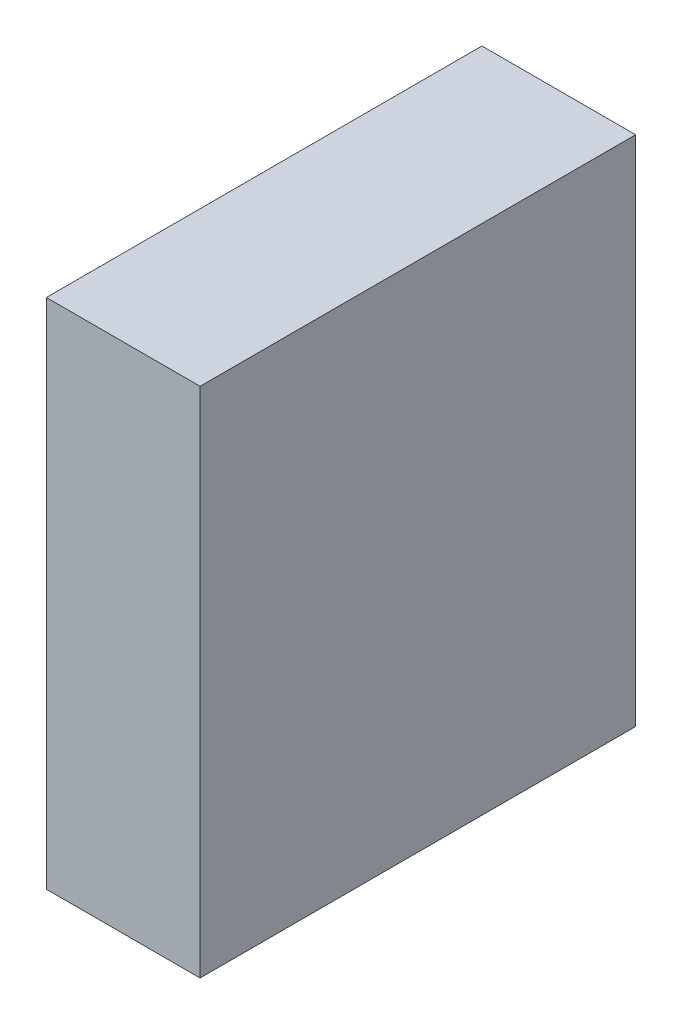
ISO-10303-21;
HEADER;
FILE_DESCRIPTION(('STEP AP214'),'2;1');
FILE_NAME('part.step','',(''),(''),'','','');
FILE_SCHEMA(('AUTOMOTIVE_DESIGN { 1 0 10303 214 1 1 1 1 }'));
ENDSEC;
DATA;
#1=APPLICATION_CONTEXT('core data for automotive mechanical design processes');
#2=APPLICATION_PROTOCOL_DEFINITION('international standard','automotive_design',2000,#1);
#3=PRODUCT_CONTEXT('',#1,'mechanical');
#4=PRODUCT('Part','Part','',(#3));
#5=PRODUCT_RELATED_PRODUCT_CATEGORY('part','',(#4));
#6=PRODUCT_DEFINITION_FORMATION('','',#4);
#7=PRODUCT_DEFINITION_CONTEXT('part definition',#1,'design');
#8=PRODUCT_DEFINITION('design','',#6,#7);
#9=PRODUCT_DEFINITION_SHAPE('','',#8);
#10=(LENGTH_UNIT() NAMED_UNIT(*) SI_UNIT(.MILLI.,.METRE.));
#11=(NAMED_UNIT(*) PLANE_ANGLE_UNIT() SI_UNIT($,.RADIAN.));
#12=(NAMED_UNIT(*) SI_UNIT($,.STERADIAN.) SOLID_ANGLE_UNIT());
#13=UNCERTAINTY_MEASURE_WITH_UNIT(LENGTH_MEASURE(1.E-05),#10,'distance_accuracy_value','');
#14=(GEOMETRIC_REPRESENTATION_CONTEXT(3) GLOBAL_UNCERTAINTY_ASSIGNED_CONTEXT((#13)) GLOBAL_UNIT_ASSIGNED_CONTEXT((#10,
#11,#12)) REPRESENTATION_CONTEXT('',''));
#15=CARTESIAN_POINT('',(0.,0.,0.));
#16=DIRECTION('',(0.,0.,1.));
#17=DIRECTION('',(1.,0.,0.));
#18=AXIS2_PLACEMENT_3D('',#15,#16,#17);
#19=CARTESIAN_POINT('',(38.1,254.,107.95));
#20=DIRECTION('',(-1.,0.,0.));
#21=DIRECTION('',(0.,0.,1.));
#22=AXIS2_PLACEMENT_3D('',#19,#20,#21);
#23=PLANE('',#22);
#24=DIRECTION('',(0.,0.,-1.));
#25=VECTOR('',#24,1.);
#26=CARTESIAN_POINT('',(38.1,0.,107.95));
#27=LINE('',#26,#25);
#28=CARTESIAN_POINT('',(38.1,0.,107.95));
#29=VERTEX_POINT('',#28);
#30=CARTESIAN_POINT('',(38.1,0.,-107.95));
#31=VERTEX_POINT('',#30);
#32=EDGE_CURVE('E104',#29,#31,#27,.T.);
#33=ORIENTED_EDGE('',*,*,#32,.T.);
#34=DIRECTION('',(0.,-1.,0.));
#35=VECTOR('',#34,1.);
#36=CARTESIAN_POINT('',(38.1,254.,-107.95));
#37=LINE('',#36,#35);
#38=CARTESIAN_POINT('',(38.1,254.,-107.95));
#39=VERTEX_POINT('',#38);
#40=EDGE_CURVE('E11',#39,#31,#37,.T.);
#41=ORIENTED_EDGE('',*,*,#40,.F.);
#42=DIRECTION('',(0.,0.,-1.));
#43=VECTOR('',#42,1.);
#44=CARTESIAN_POINT('',(38.1,254.,107.95));
#45=LINE('',#44,#43);
#46=CARTESIAN_POINT('',(38.1,254.,107.95));
#47=VERTEX_POINT('',#46);
#48=EDGE_CURVE('E92',#47,#39,#45,.T.);
#49=ORIENTED_EDGE('',*,*,#48,.F.);
#50=DIRECTION('',(0.,-1.,0.));
#51=VECTOR('',#50,1.);
#52=CARTESIAN_POINT('',(38.1,254.,107.95));
#53=LINE('',#52,#51);
#54=EDGE_CURVE('E100',#47,#29,#53,.T.);
#55=ORIENTED_EDGE('',*,*,#54,.T.);
#56=EDGE_LOOP('',(#33,#41,#49,#55));
#57=FACE_BOUND('',#56,.T.);
#58=ADVANCED_FACE('F41',(#57),#23,.F.);
#59=CARTESIAN_POINT('',(-38.1,254.,-107.95));
#60=DIRECTION('',(0.,0.,1.));
#61=DIRECTION('',(1.,0.,0.));
#62=AXIS2_PLACEMENT_3D('',#59,#60,#61);
#63=PLANE('',#62);
#64=DIRECTION('',(-1.,0.,0.));
#65=VECTOR('',#64,1.);
#66=CARTESIAN_POINT('',(-38.1,0.,-107.95));
#67=LINE('',#66,#65);
#68=CARTESIAN_POINT('',(-38.1,0.,-107.95));
#69=VERTEX_POINT('',#68);
#70=EDGE_CURVE('E96',#31,#69,#67,.T.);
#71=ORIENTED_EDGE('',*,*,#70,.T.);
#72=DIRECTION('',(0.,-1.,0.));
#73=VECTOR('',#72,1.);
#74=CARTESIAN_POINT('',(-38.1,254.,-107.95));
#75=LINE('',#74,#73);
#76=CARTESIAN_POINT('',(-38.1,254.,-107.95));
#77=VERTEX_POINT('',#76);
#78=EDGE_CURVE('E49',#77,#69,#75,.T.);
#79=ORIENTED_EDGE('',*,*,#78,.F.);
#80=DIRECTION('',(-1.,0.,0.));
#81=VECTOR('',#80,1.);
#82=CARTESIAN_POINT('',(-38.1,254.,-107.95));
#83=LINE('',#82,#81);
#84=EDGE_CURVE('E87',#39,#77,#83,.T.);
#85=ORIENTED_EDGE('',*,*,#84,.F.);
#86=ORIENTED_EDGE('',*,*,#40,.T.);
#87=EDGE_LOOP('',(#71,#79,#85,#86));
#88=FACE_BOUND('',#87,.T.);
#89=ADVANCED_FACE('F95',(#88),#63,.F.);
#90=CARTESIAN_POINT('',(-38.1,254.,107.95));
#91=DIRECTION('',(1.,0.,0.));
#92=DIRECTION('',(0.,0.,-1.));
#93=AXIS2_PLACEMENT_3D('',#90,#91,#92);
#94=PLANE('',#93);
#95=DIRECTION('',(0.,0.,1.));
#96=VECTOR('',#95,1.);
#97=CARTESIAN_POINT('',(-38.1,0.,107.95));
#98=LINE('',#97,#96);
#99=CARTESIAN_POINT('',(-38.1,0.,107.95));
#100=VERTEX_POINT('',#99);
#101=EDGE_CURVE('E74',#69,#100,#98,.T.);
#102=ORIENTED_EDGE('',*,*,#101,.T.);
#103=DIRECTION('',(0.,-1.,0.));
#104=VECTOR('',#103,1.);
#105=CARTESIAN_POINT('',(-38.1,254.,107.95));
#106=LINE('',#105,#104);
#107=CARTESIAN_POINT('',(-38.1,254.,107.95));
#108=VERTEX_POINT('',#107);
#109=EDGE_CURVE('E97',#108,#100,#106,.T.);
#110=ORIENTED_EDGE('',*,*,#109,.F.);
#111=DIRECTION('',(0.,0.,1.));
#112=VECTOR('',#111,1.);
#113=CARTESIAN_POINT('',(-38.1,254.,107.95));
#114=LINE('',#113,#112);
#115=EDGE_CURVE('E90',#77,#108,#114,.T.);
#116=ORIENTED_EDGE('',*,*,#115,.F.);
#117=ORIENTED_EDGE('',*,*,#78,.T.);
#118=EDGE_LOOP('',(#102,#110,#116,#117));
#119=FACE_BOUND('',#118,.T.);
#120=ADVANCED_FACE('F98',(#119),#94,.F.);
#121=CARTESIAN_POINT('',(-38.1,254.,107.95));
#122=DIRECTION('',(0.,0.,-1.));
#123=DIRECTION('',(-1.,0.,0.));
#124=AXIS2_PLACEMENT_3D('',#121,#122,#123);
#125=PLANE('',#124);
#126=DIRECTION('',(1.,0.,0.));
#127=VECTOR('',#126,1.);
#128=CARTESIAN_POINT('',(-38.1,0.,107.95));
#129=LINE('',#128,#127);
#130=EDGE_CURVE('E80',#100,#29,#129,.T.);
#131=ORIENTED_EDGE('',*,*,#130,.T.);
#132=ORIENTED_EDGE('',*,*,#54,.F.);
#133=DIRECTION('',(1.,0.,0.));
#134=VECTOR('',#133,1.);
#135=CARTESIAN_POINT('',(-38.1,254.,107.95));
#136=LINE('',#135,#134);
#137=EDGE_CURVE('E57',#108,#47,#136,.T.);
#138=ORIENTED_EDGE('',*,*,#137,.F.);
#139=ORIENTED_EDGE('',*,*,#109,.T.);
#140=EDGE_LOOP('',(#131,#132,#138,#139));
#141=FACE_BOUND('',#140,.T.);
#142=ADVANCED_FACE('F111',(#141),#125,.F.);
#143=CARTESIAN_POINT('',(0.,254.,0.));
#144=DIRECTION('',(0.,-1.,0.));
#145=DIRECTION('',(0.,0.,-1.));
#146=AXIS2_PLACEMENT_3D('',#143,#144,#145);
#147=PLANE('',#146);
#148=ORIENTED_EDGE('',*,*,#48,.T.);
#149=ORIENTED_EDGE('',*,*,#84,.T.);
#150=ORIENTED_EDGE('',*,*,#115,.T.);
#151=ORIENTED_EDGE('',*,*,#137,.T.);
#152=EDGE_LOOP('',(#148,#149,#150,#151));
#153=FACE_BOUND('',#152,.T.);
#154=ADVANCED_FACE('F88',(#153),#147,.F.);
#155=CARTESIAN_POINT('',(0.,0.,0.));
#156=DIRECTION('',(0.,-1.,0.));
#157=DIRECTION('',(0.,0.,-1.));
#158=AXIS2_PLACEMENT_3D('',#155,#156,#157);
#159=PLANE('',#158);
#160=ORIENTED_EDGE('',*,*,#32,.F.);
#161=ORIENTED_EDGE('',*,*,#130,.F.);
#162=ORIENTED_EDGE('',*,*,#101,.F.);
#163=ORIENTED_EDGE('',*,*,#70,.F.);
#164=EDGE_LOOP('',(#160,#161,#162,#163));
#165=FACE_BOUND('',#164,.T.);
#166=ADVANCED_FACE('F114',(#165),#159,.T.);
#167=CLOSED_SHELL('',(#58,#89,#120,#142,#154,#166));
#168=MANIFOLD_SOLID_BREP('B2',#167);
#169=ADVANCED_BREP_SHAPE_REPRESENTATION('',(#18,#168),#14);
#170=SHAPE_DEFINITION_REPRESENTATION(#9,#169);
ENDSEC;
END-ISO-10303-21;
